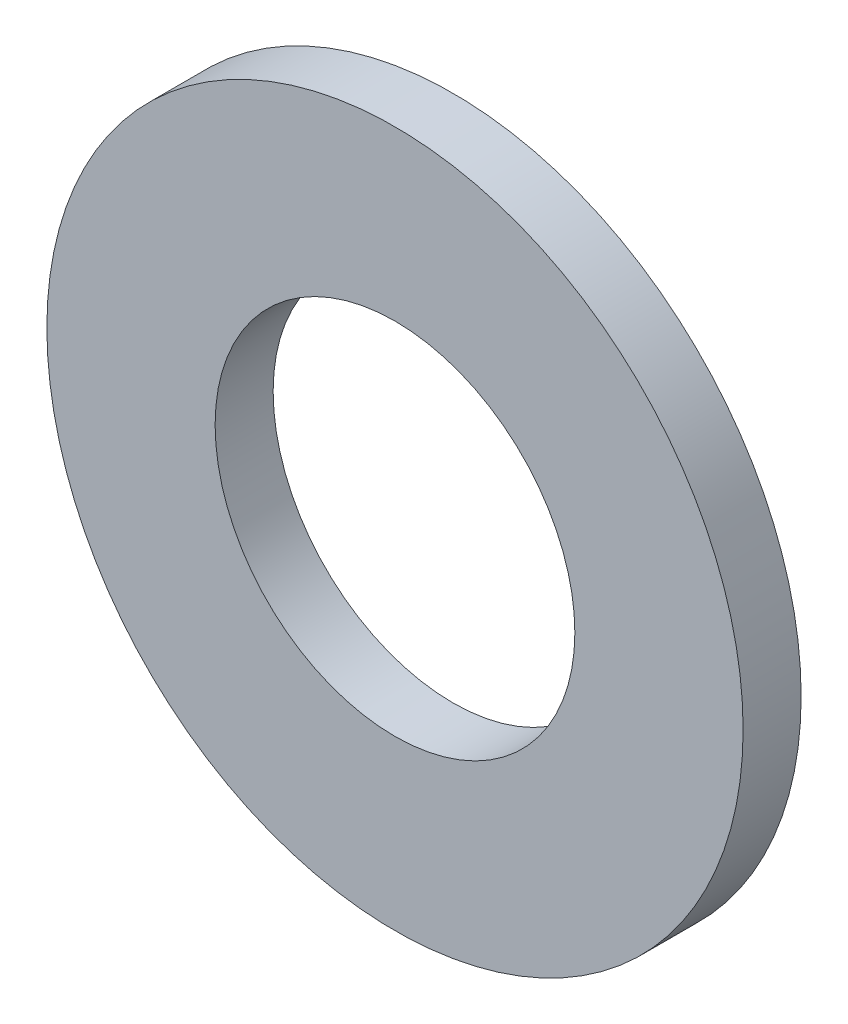
ISO-10303-21;
HEADER;
FILE_DESCRIPTION(('STEP AP214'),'2;1');
FILE_NAME('part.step','',(''),(''),'','','');
FILE_SCHEMA(('AUTOMOTIVE_DESIGN { 1 0 10303 214 1 1 1 1 }'));
ENDSEC;
DATA;
#1=APPLICATION_CONTEXT('core data for automotive mechanical design processes');
#2=APPLICATION_PROTOCOL_DEFINITION('international standard','automotive_design',2000,#1);
#3=PRODUCT_CONTEXT('',#1,'mechanical');
#4=PRODUCT('Part','Part','',(#3));
#5=PRODUCT_RELATED_PRODUCT_CATEGORY('part','',(#4));
#6=PRODUCT_DEFINITION_FORMATION('','',#4);
#7=PRODUCT_DEFINITION_CONTEXT('part definition',#1,'design');
#8=PRODUCT_DEFINITION('design','',#6,#7);
#9=PRODUCT_DEFINITION_SHAPE('','',#8);
#10=(LENGTH_UNIT() NAMED_UNIT(*) SI_UNIT(.MILLI.,.METRE.));
#11=(NAMED_UNIT(*) PLANE_ANGLE_UNIT() SI_UNIT($,.RADIAN.));
#12=(NAMED_UNIT(*) SI_UNIT($,.STERADIAN.) SOLID_ANGLE_UNIT());
#13=UNCERTAINTY_MEASURE_WITH_UNIT(LENGTH_MEASURE(1.E-05),#10,'distance_accuracy_value','');
#14=(GEOMETRIC_REPRESENTATION_CONTEXT(3) GLOBAL_UNCERTAINTY_ASSIGNED_CONTEXT((#13)) GLOBAL_UNIT_ASSIGNED_CONTEXT((#10,
#11,#12)) REPRESENTATION_CONTEXT('',''));
#15=CARTESIAN_POINT('',(0.,0.,0.));
#16=DIRECTION('',(0.,0.,1.));
#17=DIRECTION('',(1.,0.,0.));
#18=AXIS2_PLACEMENT_3D('',#15,#16,#17);
#19=CARTESIAN_POINT('',(0.,0.,1.));
#20=DIRECTION('',(0.,0.,1.));
#21=DIRECTION('',(1.,0.,0.));
#22=AXIS2_PLACEMENT_3D('',#19,#20,#21);
#23=PLANE('',#22);
#24=CARTESIAN_POINT('',(0.,0.,1.));
#25=DIRECTION('',(0.,0.,1.));
#26=DIRECTION('',(1.,0.,0.));
#27=AXIS2_PLACEMENT_3D('',#24,#25,#26);
#28=CIRCLE('',#27,6.);
#29=CARTESIAN_POINT('',(6.,0.,1.));
#30=VERTEX_POINT('',#29);
#31=EDGE_CURVE('E10',#30,#30,#28,.T.);
#32=ORIENTED_EDGE('',*,*,#31,.T.);
#33=EDGE_LOOP('',(#32));
#34=FACE_BOUND('',#33,.T.);
#35=CARTESIAN_POINT('',(0.,0.,1.));
#36=DIRECTION('',(0.,0.,1.));
#37=DIRECTION('',(1.,0.,0.));
#38=AXIS2_PLACEMENT_3D('',#35,#36,#37);
#39=CIRCLE('',#38,3.1);
#40=CARTESIAN_POINT('',(3.1,0.,1.));
#41=VERTEX_POINT('',#40);
#42=EDGE_CURVE('E41',#41,#41,#39,.T.);
#43=ORIENTED_EDGE('',*,*,#42,.F.);
#44=EDGE_LOOP('',(#43));
#45=FACE_BOUND('',#44,.T.);
#46=ADVANCED_FACE('F30',(#34,#45),#23,.T.);
#47=CARTESIAN_POINT('',(0.,0.,0.));
#48=DIRECTION('',(0.,0.,1.));
#49=DIRECTION('',(1.,0.,0.));
#50=AXIS2_PLACEMENT_3D('',#47,#48,#49);
#51=PLANE('',#50);
#52=CARTESIAN_POINT('',(0.,0.,0.));
#53=DIRECTION('',(0.,0.,1.));
#54=DIRECTION('',(1.,0.,0.));
#55=AXIS2_PLACEMENT_3D('',#52,#53,#54);
#56=CIRCLE('',#55,6.);
#57=CARTESIAN_POINT('',(6.,0.,0.));
#58=VERTEX_POINT('',#57);
#59=EDGE_CURVE('E34',#58,#58,#56,.T.);
#60=ORIENTED_EDGE('',*,*,#59,.F.);
#61=EDGE_LOOP('',(#60));
#62=FACE_BOUND('',#61,.T.);
#63=CARTESIAN_POINT('',(0.,0.,0.));
#64=DIRECTION('',(0.,0.,1.));
#65=DIRECTION('',(1.,0.,0.));
#66=AXIS2_PLACEMENT_3D('',#63,#64,#65);
#67=CIRCLE('',#66,3.1);
#68=CARTESIAN_POINT('',(3.1,0.,0.));
#69=VERTEX_POINT('',#68);
#70=EDGE_CURVE('E43',#69,#69,#67,.T.);
#71=ORIENTED_EDGE('',*,*,#70,.T.);
#72=EDGE_LOOP('',(#71));
#73=FACE_BOUND('',#72,.T.);
#74=ADVANCED_FACE('F53',(#62,#73),#51,.F.);
#75=CARTESIAN_POINT('',(0.,0.,1.));
#76=DIRECTION('',(0.,0.,-1.));
#77=DIRECTION('',(-1.,0.,0.));
#78=AXIS2_PLACEMENT_3D('',#75,#76,#77);
#79=CYLINDRICAL_SURFACE('',#78,6.);
#80=ORIENTED_EDGE('',*,*,#31,.F.);
#81=EDGE_LOOP('',(#80));
#82=FACE_BOUND('',#81,.T.);
#83=ORIENTED_EDGE('',*,*,#59,.T.);
#84=EDGE_LOOP('',(#83));
#85=FACE_BOUND('',#84,.T.);
#86=ADVANCED_FACE('F32',(#82,#85),#79,.T.);
#87=CARTESIAN_POINT('',(0.,0.,1.));
#88=DIRECTION('',(0.,0.,-1.));
#89=DIRECTION('',(-1.,0.,0.));
#90=AXIS2_PLACEMENT_3D('',#87,#88,#89);
#91=CYLINDRICAL_SURFACE('',#90,3.1);
#92=ORIENTED_EDGE('',*,*,#42,.T.);
#93=EDGE_LOOP('',(#92));
#94=FACE_BOUND('',#93,.T.);
#95=ORIENTED_EDGE('',*,*,#70,.F.);
#96=EDGE_LOOP('',(#95));
#97=FACE_BOUND('',#96,.T.);
#98=ADVANCED_FACE('F49',(#94,#97),#91,.F.);
#99=CLOSED_SHELL('',(#46,#74,#86,#98));
#100=MANIFOLD_SOLID_BREP('B2',#99);
#101=ADVANCED_BREP_SHAPE_REPRESENTATION('',(#18,#100),#14);
#102=SHAPE_DEFINITION_REPRESENTATION(#9,#101);
ENDSEC;
END-ISO-10303-21;
